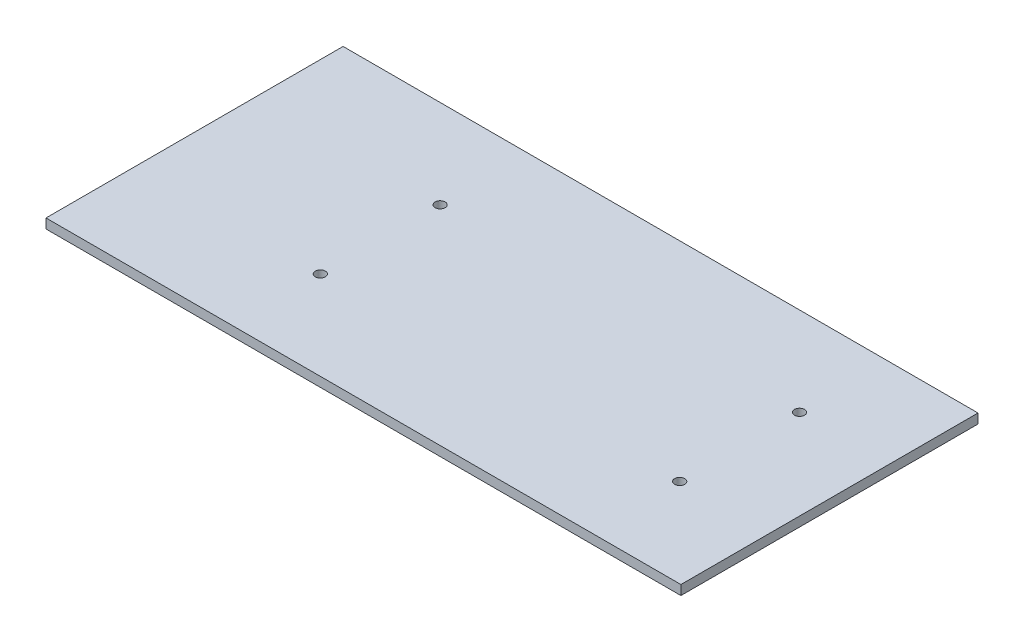
ISO-10303-21;
HEADER;
FILE_DESCRIPTION(('STEP AP214'),'2;1');
FILE_NAME('part.step','',(''),(''),'','','');
FILE_SCHEMA(('AUTOMOTIVE_DESIGN { 1 0 10303 214 1 1 1 1 }'));
ENDSEC;
DATA;
#1=APPLICATION_CONTEXT('core data for automotive mechanical design processes');
#2=APPLICATION_PROTOCOL_DEFINITION('international standard','automotive_design',2000,#1);
#3=PRODUCT_CONTEXT('',#1,'mechanical');
#4=PRODUCT('Part','Part','',(#3));
#5=PRODUCT_RELATED_PRODUCT_CATEGORY('part','',(#4));
#6=PRODUCT_DEFINITION_FORMATION('','',#4);
#7=PRODUCT_DEFINITION_CONTEXT('part definition',#1,'design');
#8=PRODUCT_DEFINITION('design','',#6,#7);
#9=PRODUCT_DEFINITION_SHAPE('','',#8);
#10=(LENGTH_UNIT() NAMED_UNIT(*) SI_UNIT(.MILLI.,.METRE.));
#11=(NAMED_UNIT(*) PLANE_ANGLE_UNIT() SI_UNIT($,.RADIAN.));
#12=(NAMED_UNIT(*) SI_UNIT($,.STERADIAN.) SOLID_ANGLE_UNIT());
#13=UNCERTAINTY_MEASURE_WITH_UNIT(LENGTH_MEASURE(1.E-05),#10,'distance_accuracy_value','');
#14=(GEOMETRIC_REPRESENTATION_CONTEXT(3) GLOBAL_UNCERTAINTY_ASSIGNED_CONTEXT((#13)) GLOBAL_UNIT_ASSIGNED_CONTEXT((#10,
#11,#12)) REPRESENTATION_CONTEXT('',''));
#15=CARTESIAN_POINT('',(0.,0.,0.));
#16=DIRECTION('',(0.,0.,1.));
#17=DIRECTION('',(1.,0.,0.));
#18=AXIS2_PLACEMENT_3D('',#15,#16,#17);
#19=CARTESIAN_POINT('',(0.,0.,0.));
#20=DIRECTION('',(0.,-1.,0.));
#21=DIRECTION('',(0.,0.,-1.));
#22=AXIS2_PLACEMENT_3D('',#19,#20,#21);
#23=PLANE('',#22);
#24=DIRECTION('',(0.,0.,-1.));
#25=VECTOR('',#24,1.);
#26=CARTESIAN_POINT('',(219.5,0.,116.));
#27=LINE('',#26,#25);
#28=CARTESIAN_POINT('',(219.5,0.,119.5));
#29=VERTEX_POINT('',#28);
#30=CARTESIAN_POINT('',(219.5,0.,-4.50000000000002));
#31=VERTEX_POINT('',#30);
#32=EDGE_CURVE('E91',#29,#31,#27,.T.);
#33=ORIENTED_EDGE('',*,*,#32,.T.);
#34=DIRECTION('',(1.,0.,0.));
#35=VECTOR('',#34,1.);
#36=CARTESIAN_POINT('',(215.9,0.,-4.50000000000002));
#37=LINE('',#36,#35);
#38=CARTESIAN_POINT('',(-45.5,0.,-4.5));
#39=VERTEX_POINT('',#38);
#40=EDGE_CURVE('E73',#39,#31,#37,.T.);
#41=ORIENTED_EDGE('',*,*,#40,.F.);
#42=DIRECTION('',(0.,0.,1.));
#43=VECTOR('',#42,1.);
#44=CARTESIAN_POINT('',(-45.5,0.,-4.5));
#45=LINE('',#44,#43);
#46=CARTESIAN_POINT('',(-45.5,0.,119.5));
#47=VERTEX_POINT('',#46);
#48=EDGE_CURVE('E13',#39,#47,#45,.T.);
#49=ORIENTED_EDGE('',*,*,#48,.T.);
#50=DIRECTION('',(1.,0.,0.));
#51=VECTOR('',#50,1.);
#52=CARTESIAN_POINT('',(219.6,0.,119.5));
#53=LINE('',#52,#51);
#54=EDGE_CURVE('E67',#47,#29,#53,.T.);
#55=ORIENTED_EDGE('',*,*,#54,.T.);
#56=EDGE_LOOP('',(#33,#41,#49,#55));
#57=FACE_BOUND('',#56,.T.);
#58=CARTESIAN_POINT('',(32.,0.,32.5));
#59=DIRECTION('',(0.,1.,0.));
#60=DIRECTION('',(0.,0.,1.));
#61=AXIS2_PLACEMENT_3D('',#58,#59,#60);
#62=CIRCLE('',#61,2.1);
#63=CARTESIAN_POINT('',(32.,0.,34.6));
#64=VERTEX_POINT('',#63);
#65=EDGE_CURVE('E124',#64,#64,#62,.T.);
#66=ORIENTED_EDGE('',*,*,#65,.F.);
#67=EDGE_LOOP('',(#66));
#68=FACE_BOUND('',#67,.T.);
#69=CARTESIAN_POINT('',(182.,0.,32.5));
#70=DIRECTION('',(0.,1.,0.));
#71=DIRECTION('',(0.,0.,1.));
#72=AXIS2_PLACEMENT_3D('',#69,#70,#71);
#73=CIRCLE('',#72,2.09999999999999);
#74=CARTESIAN_POINT('',(182.,0.,34.6));
#75=VERTEX_POINT('',#74);
#76=EDGE_CURVE('E127',#75,#75,#73,.T.);
#77=ORIENTED_EDGE('',*,*,#76,.F.);
#78=EDGE_LOOP('',(#77));
#79=FACE_BOUND('',#78,.T.);
#80=CARTESIAN_POINT('',(182.,0.,82.5));
#81=DIRECTION('',(0.,1.,0.));
#82=DIRECTION('',(0.,0.,1.));
#83=AXIS2_PLACEMENT_3D('',#80,#81,#82);
#84=CIRCLE('',#83,2.09999999999999);
#85=CARTESIAN_POINT('',(182.,0.,84.6));
#86=VERTEX_POINT('',#85);
#87=EDGE_CURVE('E140',#86,#86,#84,.T.);
#88=ORIENTED_EDGE('',*,*,#87,.F.);
#89=EDGE_LOOP('',(#88));
#90=FACE_BOUND('',#89,.T.);
#91=CARTESIAN_POINT('',(32.,0.,82.5));
#92=DIRECTION('',(0.,1.,0.));
#93=DIRECTION('',(0.,0.,1.));
#94=AXIS2_PLACEMENT_3D('',#91,#92,#93);
#95=CIRCLE('',#94,2.1);
#96=CARTESIAN_POINT('',(32.,0.,84.6));
#97=VERTEX_POINT('',#96);
#98=EDGE_CURVE('E133',#97,#97,#95,.T.);
#99=ORIENTED_EDGE('',*,*,#98,.F.);
#100=EDGE_LOOP('',(#99));
#101=FACE_BOUND('',#100,.T.);
#102=ADVANCED_FACE('F52',(#57,#68,#79,#90,#101),#23,.F.);
#103=CARTESIAN_POINT('',(0.,-4.,-4.5));
#104=DIRECTION('',(0.,0.,-1.));
#105=DIRECTION('',(-1.,0.,0.));
#106=AXIS2_PLACEMENT_3D('',#103,#104,#105);
#107=PLANE('',#106);
#108=DIRECTION('',(0.,1.,0.));
#109=VECTOR('',#108,1.);
#110=CARTESIAN_POINT('',(-45.5,-4.,-4.5));
#111=LINE('',#110,#109);
#112=CARTESIAN_POINT('',(-45.5,-4.,-4.5));
#113=VERTEX_POINT('',#112);
#114=EDGE_CURVE('E105',#113,#39,#111,.T.);
#115=ORIENTED_EDGE('',*,*,#114,.T.);
#116=ORIENTED_EDGE('',*,*,#40,.T.);
#117=DIRECTION('',(0.,1.,0.));
#118=VECTOR('',#117,1.);
#119=CARTESIAN_POINT('',(219.5,-4.,-4.5));
#120=LINE('',#119,#118);
#121=CARTESIAN_POINT('',(219.5,-4.,-4.5));
#122=VERTEX_POINT('',#121);
#123=EDGE_CURVE('E102',#122,#31,#120,.T.);
#124=ORIENTED_EDGE('',*,*,#123,.F.);
#125=DIRECTION('',(1.,0.,0.));
#126=VECTOR('',#125,1.);
#127=CARTESIAN_POINT('',(0.,-4.,-4.5));
#128=LINE('',#127,#126);
#129=EDGE_CURVE('E117',#113,#122,#128,.T.);
#130=ORIENTED_EDGE('',*,*,#129,.F.);
#131=EDGE_LOOP('',(#115,#116,#124,#130));
#132=FACE_BOUND('',#131,.T.);
#133=ADVANCED_FACE('F101',(#132),#107,.T.);
#134=CARTESIAN_POINT('',(0.,-4.,119.5));
#135=DIRECTION('',(0.,0.,-1.));
#136=DIRECTION('',(-1.,0.,0.));
#137=AXIS2_PLACEMENT_3D('',#134,#135,#136);
#138=PLANE('',#137);
#139=ORIENTED_EDGE('',*,*,#54,.F.);
#140=DIRECTION('',(0.,1.,0.));
#141=VECTOR('',#140,1.);
#142=CARTESIAN_POINT('',(-45.5,-4.,119.5));
#143=LINE('',#142,#141);
#144=CARTESIAN_POINT('',(-45.5,-4.,119.5));
#145=VERTEX_POINT('',#144);
#146=EDGE_CURVE('E60',#145,#47,#143,.T.);
#147=ORIENTED_EDGE('',*,*,#146,.F.);
#148=DIRECTION('',(1.,0.,0.));
#149=VECTOR('',#148,1.);
#150=CARTESIAN_POINT('',(0.,-4.,119.5));
#151=LINE('',#150,#149);
#152=CARTESIAN_POINT('',(219.5,-4.,119.5));
#153=VERTEX_POINT('',#152);
#154=EDGE_CURVE('E120',#145,#153,#151,.T.);
#155=ORIENTED_EDGE('',*,*,#154,.T.);
#156=DIRECTION('',(0.,1.,0.));
#157=VECTOR('',#156,1.);
#158=CARTESIAN_POINT('',(219.5,-4.,119.5));
#159=LINE('',#158,#157);
#160=EDGE_CURVE('E108',#153,#29,#159,.T.);
#161=ORIENTED_EDGE('',*,*,#160,.T.);
#162=EDGE_LOOP('',(#139,#147,#155,#161));
#163=FACE_BOUND('',#162,.T.);
#164=ADVANCED_FACE('F192',(#163),#138,.F.);
#165=CARTESIAN_POINT('',(219.5,-4.,-4.5));
#166=DIRECTION('',(-1.,0.,0.));
#167=DIRECTION('',(0.,0.,1.));
#168=AXIS2_PLACEMENT_3D('',#165,#166,#167);
#169=PLANE('',#168);
#170=ORIENTED_EDGE('',*,*,#123,.T.);
#171=ORIENTED_EDGE('',*,*,#32,.F.);
#172=ORIENTED_EDGE('',*,*,#160,.F.);
#173=DIRECTION('',(0.,0.,1.));
#174=VECTOR('',#173,1.);
#175=CARTESIAN_POINT('',(219.5,-4.,-4.5));
#176=LINE('',#175,#174);
#177=EDGE_CURVE('E107',#122,#153,#176,.T.);
#178=ORIENTED_EDGE('',*,*,#177,.F.);
#179=EDGE_LOOP('',(#170,#171,#172,#178));
#180=FACE_BOUND('',#179,.T.);
#181=ADVANCED_FACE('F54',(#180),#169,.F.);
#182=CARTESIAN_POINT('',(-45.5,-4.,-4.5));
#183=DIRECTION('',(-1.,0.,0.));
#184=DIRECTION('',(0.,0.,1.));
#185=AXIS2_PLACEMENT_3D('',#182,#183,#184);
#186=PLANE('',#185);
#187=ORIENTED_EDGE('',*,*,#48,.F.);
#188=ORIENTED_EDGE('',*,*,#114,.F.);
#189=DIRECTION('',(0.,0.,1.));
#190=VECTOR('',#189,1.);
#191=CARTESIAN_POINT('',(-45.5,-4.,-4.5));
#192=LINE('',#191,#190);
#193=EDGE_CURVE('E111',#113,#145,#192,.T.);
#194=ORIENTED_EDGE('',*,*,#193,.T.);
#195=ORIENTED_EDGE('',*,*,#146,.T.);
#196=EDGE_LOOP('',(#187,#188,#194,#195));
#197=FACE_BOUND('',#196,.T.);
#198=ADVANCED_FACE('F178',(#197),#186,.T.);
#199=CARTESIAN_POINT('',(0.,-4.,0.));
#200=DIRECTION('',(0.,-1.,0.));
#201=DIRECTION('',(0.,0.,-1.));
#202=AXIS2_PLACEMENT_3D('',#199,#200,#201);
#203=PLANE('',#202);
#204=CARTESIAN_POINT('',(-33.499999999999,-4.,7.50000000000001));
#205=DIRECTION('',(0.,-1.,0.));
#206=DIRECTION('',(0.,0.,-1.));
#207=AXIS2_PLACEMENT_3D('',#204,#205,#206);
#208=CIRCLE('',#207,7.5);
#209=CARTESIAN_POINT('',(-33.499999999999,-4.,0.));
#210=VERTEX_POINT('',#209);
#211=EDGE_CURVE('E156',#210,#210,#208,.T.);
#212=ORIENTED_EDGE('',*,*,#211,.F.);
#213=EDGE_LOOP('',(#212));
#214=FACE_BOUND('',#213,.T.);
#215=CARTESIAN_POINT('',(207.5,-4.,7.50000000000001));
#216=DIRECTION('',(0.,-1.,0.));
#217=DIRECTION('',(0.,0.,-1.));
#218=AXIS2_PLACEMENT_3D('',#215,#216,#217);
#219=CIRCLE('',#218,7.50000000000001);
#220=CARTESIAN_POINT('',(207.5,-4.,0.));
#221=VERTEX_POINT('',#220);
#222=EDGE_CURVE('E162',#221,#221,#219,.T.);
#223=ORIENTED_EDGE('',*,*,#222,.F.);
#224=EDGE_LOOP('',(#223));
#225=FACE_BOUND('',#224,.T.);
#226=CARTESIAN_POINT('',(207.499999999999,-4.,107.5));
#227=DIRECTION('',(0.,-1.,0.));
#228=DIRECTION('',(0.,0.,-1.));
#229=AXIS2_PLACEMENT_3D('',#226,#227,#228);
#230=CIRCLE('',#229,7.50000000000001);
#231=CARTESIAN_POINT('',(207.499999999999,-4.,100.));
#232=VERTEX_POINT('',#231);
#233=EDGE_CURVE('E151',#232,#232,#230,.T.);
#234=ORIENTED_EDGE('',*,*,#233,.F.);
#235=EDGE_LOOP('',(#234));
#236=FACE_BOUND('',#235,.T.);
#237=CARTESIAN_POINT('',(-33.5,-4.,107.5));
#238=DIRECTION('',(0.,-1.,0.));
#239=DIRECTION('',(0.,0.,-1.));
#240=AXIS2_PLACEMENT_3D('',#237,#238,#239);
#241=CIRCLE('',#240,7.5);
#242=CARTESIAN_POINT('',(-33.5,-4.,100.));
#243=VERTEX_POINT('',#242);
#244=EDGE_CURVE('E148',#243,#243,#241,.T.);
#245=ORIENTED_EDGE('',*,*,#244,.F.);
#246=EDGE_LOOP('',(#245));
#247=FACE_BOUND('',#246,.T.);
#248=CARTESIAN_POINT('',(32.,-4.,82.5));
#249=DIRECTION('',(0.,1.,0.));
#250=DIRECTION('',(0.,0.,1.));
#251=AXIS2_PLACEMENT_3D('',#248,#249,#250);
#252=CIRCLE('',#251,2.1);
#253=CARTESIAN_POINT('',(32.,-4.,84.6));
#254=VERTEX_POINT('',#253);
#255=EDGE_CURVE('E130',#254,#254,#252,.T.);
#256=ORIENTED_EDGE('',*,*,#255,.T.);
#257=EDGE_LOOP('',(#256));
#258=FACE_BOUND('',#257,.T.);
#259=CARTESIAN_POINT('',(182.,-4.,82.5));
#260=DIRECTION('',(0.,1.,0.));
#261=DIRECTION('',(0.,0.,1.));
#262=AXIS2_PLACEMENT_3D('',#259,#260,#261);
#263=CIRCLE('',#262,2.09999999999999);
#264=CARTESIAN_POINT('',(182.,-4.,84.6));
#265=VERTEX_POINT('',#264);
#266=EDGE_CURVE('E137',#265,#265,#263,.T.);
#267=ORIENTED_EDGE('',*,*,#266,.T.);
#268=EDGE_LOOP('',(#267));
#269=FACE_BOUND('',#268,.T.);
#270=CARTESIAN_POINT('',(182.,-4.,32.5));
#271=DIRECTION('',(0.,1.,0.));
#272=DIRECTION('',(0.,0.,1.));
#273=AXIS2_PLACEMENT_3D('',#270,#271,#272);
#274=CIRCLE('',#273,2.09999999999999);
#275=CARTESIAN_POINT('',(182.,-4.,34.6));
#276=VERTEX_POINT('',#275);
#277=EDGE_CURVE('E143',#276,#276,#274,.T.);
#278=ORIENTED_EDGE('',*,*,#277,.T.);
#279=EDGE_LOOP('',(#278));
#280=FACE_BOUND('',#279,.T.);
#281=CARTESIAN_POINT('',(32.,-4.,32.5));
#282=DIRECTION('',(0.,1.,0.));
#283=DIRECTION('',(0.,0.,1.));
#284=AXIS2_PLACEMENT_3D('',#281,#282,#283);
#285=CIRCLE('',#284,2.1);
#286=CARTESIAN_POINT('',(32.,-4.,34.6));
#287=VERTEX_POINT('',#286);
#288=EDGE_CURVE('E123',#287,#287,#285,.T.);
#289=ORIENTED_EDGE('',*,*,#288,.T.);
#290=EDGE_LOOP('',(#289));
#291=FACE_BOUND('',#290,.T.);
#292=ORIENTED_EDGE('',*,*,#154,.F.);
#293=ORIENTED_EDGE('',*,*,#193,.F.);
#294=ORIENTED_EDGE('',*,*,#129,.T.);
#295=ORIENTED_EDGE('',*,*,#177,.T.);
#296=EDGE_LOOP('',(#292,#293,#294,#295));
#297=FACE_BOUND('',#296,.T.);
#298=ADVANCED_FACE('F174',(#214,#225,#236,#247,#258,#269,#280,#291,#297),#203,.T.);
#299=CARTESIAN_POINT('',(32.,-4.,32.5));
#300=DIRECTION('',(0.,1.,0.));
#301=DIRECTION('',(0.,0.,1.));
#302=AXIS2_PLACEMENT_3D('',#299,#300,#301);
#303=CYLINDRICAL_SURFACE('',#302,2.1);
#304=ORIENTED_EDGE('',*,*,#288,.F.);
#305=EDGE_LOOP('',(#304));
#306=FACE_BOUND('',#305,.T.);
#307=ORIENTED_EDGE('',*,*,#65,.T.);
#308=EDGE_LOOP('',(#307));
#309=FACE_BOUND('',#308,.T.);
#310=ADVANCED_FACE('F177',(#306,#309),#303,.F.);
#311=CARTESIAN_POINT('',(182.,-4.,32.5));
#312=DIRECTION('',(0.,1.,0.));
#313=DIRECTION('',(0.,0.,1.));
#314=AXIS2_PLACEMENT_3D('',#311,#312,#313);
#315=CYLINDRICAL_SURFACE('',#314,2.09999999999999);
#316=ORIENTED_EDGE('',*,*,#277,.F.);
#317=EDGE_LOOP('',(#316));
#318=FACE_BOUND('',#317,.T.);
#319=ORIENTED_EDGE('',*,*,#76,.T.);
#320=EDGE_LOOP('',(#319));
#321=FACE_BOUND('',#320,.T.);
#322=ADVANCED_FACE('F224',(#318,#321),#315,.F.);
#323=CARTESIAN_POINT('',(182.,-4.,82.5));
#324=DIRECTION('',(0.,1.,0.));
#325=DIRECTION('',(0.,0.,1.));
#326=AXIS2_PLACEMENT_3D('',#323,#324,#325);
#327=CYLINDRICAL_SURFACE('',#326,2.09999999999999);
#328=ORIENTED_EDGE('',*,*,#266,.F.);
#329=EDGE_LOOP('',(#328));
#330=FACE_BOUND('',#329,.T.);
#331=ORIENTED_EDGE('',*,*,#87,.T.);
#332=EDGE_LOOP('',(#331));
#333=FACE_BOUND('',#332,.T.);
#334=ADVANCED_FACE('F227',(#330,#333),#327,.F.);
#335=CARTESIAN_POINT('',(32.,-4.,82.5));
#336=DIRECTION('',(0.,1.,0.));
#337=DIRECTION('',(0.,0.,1.));
#338=AXIS2_PLACEMENT_3D('',#335,#336,#337);
#339=CYLINDRICAL_SURFACE('',#338,2.1);
#340=ORIENTED_EDGE('',*,*,#255,.F.);
#341=EDGE_LOOP('',(#340));
#342=FACE_BOUND('',#341,.T.);
#343=ORIENTED_EDGE('',*,*,#98,.T.);
#344=EDGE_LOOP('',(#343));
#345=FACE_BOUND('',#344,.T.);
#346=ADVANCED_FACE('F222',(#342,#345),#339,.F.);
#347=CARTESIAN_POINT('',(-33.5,-3.,107.5));
#348=DIRECTION('',(0.,-1.,0.));
#349=DIRECTION('',(0.,0.,-1.));
#350=AXIS2_PLACEMENT_3D('',#347,#348,#349);
#351=CYLINDRICAL_SURFACE('',#350,7.5);
#352=CARTESIAN_POINT('',(-33.5,-3.,107.5));
#353=DIRECTION('',(0.,-1.,0.));
#354=DIRECTION('',(0.,0.,-1.));
#355=AXIS2_PLACEMENT_3D('',#352,#353,#354);
#356=CIRCLE('',#355,7.5);
#357=CARTESIAN_POINT('',(-33.5,-3.,100.));
#358=VERTEX_POINT('',#357);
#359=EDGE_CURVE('E134',#358,#358,#356,.T.);
#360=ORIENTED_EDGE('',*,*,#359,.F.);
#361=EDGE_LOOP('',(#360));
#362=FACE_BOUND('',#361,.T.);
#363=ORIENTED_EDGE('',*,*,#244,.T.);
#364=EDGE_LOOP('',(#363));
#365=FACE_BOUND('',#364,.T.);
#366=ADVANCED_FACE('F218',(#362,#365),#351,.F.);
#367=CARTESIAN_POINT('',(-33.5,-3.,107.5));
#368=DIRECTION('',(0.,-1.,0.));
#369=DIRECTION('',(0.,0.,-1.));
#370=AXIS2_PLACEMENT_3D('',#367,#368,#369);
#371=PLANE('',#370);
#372=ORIENTED_EDGE('',*,*,#359,.T.);
#373=EDGE_LOOP('',(#372));
#374=FACE_BOUND('',#373,.T.);
#375=ADVANCED_FACE('F215',(#374),#371,.T.);
#376=CARTESIAN_POINT('',(207.499999999999,-3.,107.5));
#377=DIRECTION('',(0.,-1.,0.));
#378=DIRECTION('',(0.,0.,-1.));
#379=AXIS2_PLACEMENT_3D('',#376,#377,#378);
#380=CYLINDRICAL_SURFACE('',#379,7.50000000000001);
#381=CARTESIAN_POINT('',(207.499999999999,-3.,107.5));
#382=DIRECTION('',(0.,-1.,0.));
#383=DIRECTION('',(0.,0.,-1.));
#384=AXIS2_PLACEMENT_3D('',#381,#382,#383);
#385=CIRCLE('',#384,7.50000000000001);
#386=CARTESIAN_POINT('',(207.499999999999,-3.,100.));
#387=VERTEX_POINT('',#386);
#388=EDGE_CURVE('E165',#387,#387,#385,.T.);
#389=ORIENTED_EDGE('',*,*,#388,.F.);
#390=EDGE_LOOP('',(#389));
#391=FACE_BOUND('',#390,.T.);
#392=ORIENTED_EDGE('',*,*,#233,.T.);
#393=EDGE_LOOP('',(#392));
#394=FACE_BOUND('',#393,.T.);
#395=ADVANCED_FACE('F172',(#391,#394),#380,.F.);
#396=CARTESIAN_POINT('',(207.499999999999,-3.,107.5));
#397=DIRECTION('',(0.,-1.,0.));
#398=DIRECTION('',(0.,0.,-1.));
#399=AXIS2_PLACEMENT_3D('',#396,#397,#398);
#400=PLANE('',#399);
#401=ORIENTED_EDGE('',*,*,#388,.T.);
#402=EDGE_LOOP('',(#401));
#403=FACE_BOUND('',#402,.T.);
#404=ADVANCED_FACE('F259',(#403),#400,.T.);
#405=CARTESIAN_POINT('',(207.5,-3.,7.50000000000001));
#406=DIRECTION('',(0.,-1.,0.));
#407=DIRECTION('',(0.,0.,-1.));
#408=AXIS2_PLACEMENT_3D('',#405,#406,#407);
#409=CYLINDRICAL_SURFACE('',#408,7.50000000000001);
#410=CARTESIAN_POINT('',(207.5,-3.,7.50000000000001));
#411=DIRECTION('',(0.,-1.,0.));
#412=DIRECTION('',(0.,0.,-1.));
#413=AXIS2_PLACEMENT_3D('',#410,#411,#412);
#414=CIRCLE('',#413,7.50000000000001);
#415=CARTESIAN_POINT('',(207.5,-3.,0.));
#416=VERTEX_POINT('',#415);
#417=EDGE_CURVE('E159',#416,#416,#414,.T.);
#418=ORIENTED_EDGE('',*,*,#417,.F.);
#419=EDGE_LOOP('',(#418));
#420=FACE_BOUND('',#419,.T.);
#421=ORIENTED_EDGE('',*,*,#222,.T.);
#422=EDGE_LOOP('',(#421));
#423=FACE_BOUND('',#422,.T.);
#424=ADVANCED_FACE('F267',(#420,#423),#409,.F.);
#425=CARTESIAN_POINT('',(207.5,-3.,7.50000000000001));
#426=DIRECTION('',(0.,-1.,0.));
#427=DIRECTION('',(0.,0.,-1.));
#428=AXIS2_PLACEMENT_3D('',#425,#426,#427);
#429=PLANE('',#428);
#430=ORIENTED_EDGE('',*,*,#417,.T.);
#431=EDGE_LOOP('',(#430));
#432=FACE_BOUND('',#431,.T.);
#433=ADVANCED_FACE('F210',(#432),#429,.T.);
#434=CARTESIAN_POINT('',(-33.499999999999,-3.,7.50000000000001));
#435=DIRECTION('',(0.,-1.,0.));
#436=DIRECTION('',(0.,0.,-1.));
#437=AXIS2_PLACEMENT_3D('',#434,#435,#436);
#438=CYLINDRICAL_SURFACE('',#437,7.5);
#439=CARTESIAN_POINT('',(-33.499999999999,-3.,7.50000000000001));
#440=DIRECTION('',(0.,-1.,0.));
#441=DIRECTION('',(0.,0.,-1.));
#442=AXIS2_PLACEMENT_3D('',#439,#440,#441);
#443=CIRCLE('',#442,7.5);
#444=CARTESIAN_POINT('',(-33.499999999999,-3.,0.));
#445=VERTEX_POINT('',#444);
#446=EDGE_CURVE('E96',#445,#445,#443,.T.);
#447=ORIENTED_EDGE('',*,*,#446,.F.);
#448=EDGE_LOOP('',(#447));
#449=FACE_BOUND('',#448,.T.);
#450=ORIENTED_EDGE('',*,*,#211,.T.);
#451=EDGE_LOOP('',(#450));
#452=FACE_BOUND('',#451,.T.);
#453=ADVANCED_FACE('F203',(#449,#452),#438,.F.);
#454=CARTESIAN_POINT('',(-33.499999999999,-3.,7.50000000000001));
#455=DIRECTION('',(0.,-1.,0.));
#456=DIRECTION('',(0.,0.,-1.));
#457=AXIS2_PLACEMENT_3D('',#454,#455,#456);
#458=PLANE('',#457);
#459=ORIENTED_EDGE('',*,*,#446,.T.);
#460=EDGE_LOOP('',(#459));
#461=FACE_BOUND('',#460,.T.);
#462=ADVANCED_FACE('F201',(#461),#458,.T.);
#463=CLOSED_SHELL('',(#102,#133,#164,#181,#198,#298,#310,#322,#334,#346,#366,#375,#395,#404,
#424,#433,#453,#462));
#464=MANIFOLD_SOLID_BREP('B2',#463);
#465=ADVANCED_BREP_SHAPE_REPRESENTATION('',(#18,#464),#14);
#466=SHAPE_DEFINITION_REPRESENTATION(#9,#465);
ENDSEC;
END-ISO-10303-21;
